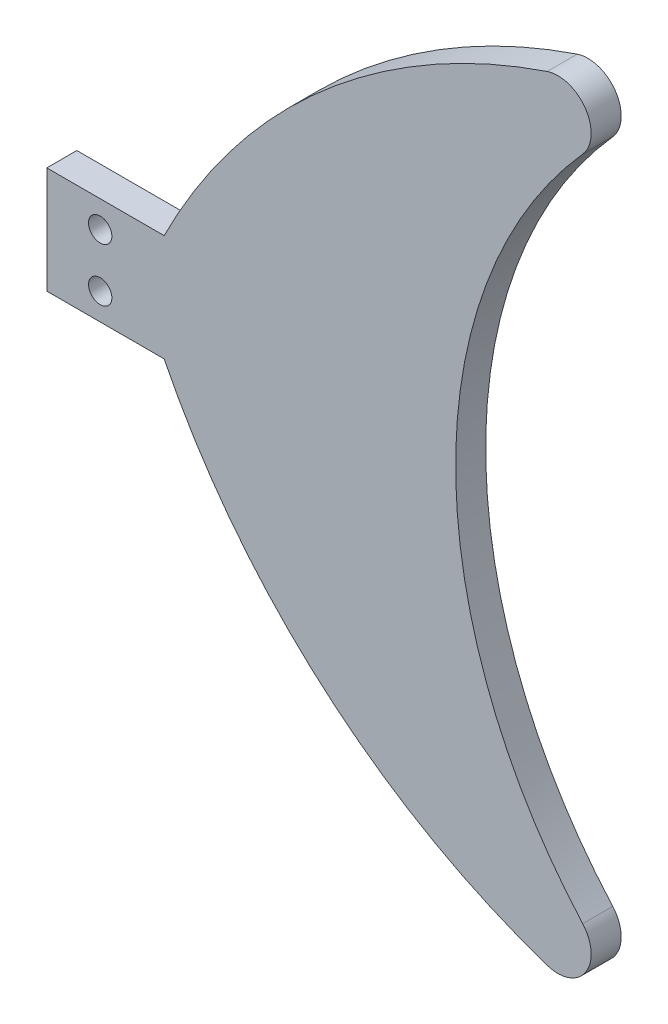
ISO-10303-21;
HEADER;
FILE_DESCRIPTION(('STEP AP214'),'2;1');
FILE_NAME('part.step','',(''),(''),'','','');
FILE_SCHEMA(('AUTOMOTIVE_DESIGN { 1 0 10303 214 1 1 1 1 }'));
ENDSEC;
DATA;
#1=APPLICATION_CONTEXT('core data for automotive mechanical design processes');
#2=APPLICATION_PROTOCOL_DEFINITION('international standard','automotive_design',2000,#1);
#3=PRODUCT_CONTEXT('',#1,'mechanical');
#4=PRODUCT('Part','Part','',(#3));
#5=PRODUCT_RELATED_PRODUCT_CATEGORY('part','',(#4));
#6=PRODUCT_DEFINITION_FORMATION('','',#4);
#7=PRODUCT_DEFINITION_CONTEXT('part definition',#1,'design');
#8=PRODUCT_DEFINITION('design','',#6,#7);
#9=PRODUCT_DEFINITION_SHAPE('','',#8);
#10=(LENGTH_UNIT() NAMED_UNIT(*) SI_UNIT(.MILLI.,.METRE.));
#11=(NAMED_UNIT(*) PLANE_ANGLE_UNIT() SI_UNIT($,.RADIAN.));
#12=(NAMED_UNIT(*) SI_UNIT($,.STERADIAN.) SOLID_ANGLE_UNIT());
#13=UNCERTAINTY_MEASURE_WITH_UNIT(LENGTH_MEASURE(1.E-05),#10,'distance_accuracy_value','');
#14=(GEOMETRIC_REPRESENTATION_CONTEXT(3) GLOBAL_UNCERTAINTY_ASSIGNED_CONTEXT((#13)) GLOBAL_UNIT_ASSIGNED_CONTEXT((#10,
#11,#12)) REPRESENTATION_CONTEXT('',''));
#15=CARTESIAN_POINT('',(0.,0.,0.));
#16=DIRECTION('',(0.,0.,1.));
#17=DIRECTION('',(1.,0.,0.));
#18=AXIS2_PLACEMENT_3D('',#15,#16,#17);
#19=CARTESIAN_POINT('',(-1.93712943361398,0.,0.));
#20=DIRECTION('',(0.,0.,1.));
#21=DIRECTION('',(1.,0.,0.));
#22=AXIS2_PLACEMENT_3D('',#19,#20,#21);
#23=PLANE('',#22);
#24=CARTESIAN_POINT('',(-15.,-4.,0.));
#25=DIRECTION('',(0.,0.,1.));
#26=DIRECTION('',(-1.,0.,0.));
#27=AXIS2_PLACEMENT_3D('',#24,#25,#26);
#28=CIRCLE('',#27,1.75);
#29=CARTESIAN_POINT('',(-16.75,-4.,0.));
#30=VERTEX_POINT('',#29);
#31=EDGE_CURVE('E226',#30,#30,#28,.T.);
#32=ORIENTED_EDGE('',*,*,#31,.T.);
#33=EDGE_LOOP('',(#32));
#34=FACE_BOUND('',#33,.T.);
#35=CARTESIAN_POINT('',(-15.,4.,0.));
#36=DIRECTION('',(0.,0.,1.));
#37=DIRECTION('',(1.,0.,0.));
#38=AXIS2_PLACEMENT_3D('',#35,#36,#37);
#39=CIRCLE('',#38,1.75);
#40=CARTESIAN_POINT('',(-13.25,4.,0.));
#41=VERTEX_POINT('',#40);
#42=EDGE_CURVE('E125',#41,#41,#39,.T.);
#43=ORIENTED_EDGE('',*,*,#42,.T.);
#44=EDGE_LOOP('',(#43));
#45=FACE_BOUND('',#44,.T.);
#46=CARTESIAN_POINT('',(84.0294989382702,36.7226286448998,0.));
#47=DIRECTION('',(0.,0.,1.));
#48=DIRECTION('',(1.,0.,0.));
#49=AXIS2_PLACEMENT_3D('',#46,#47,#48);
#50=CIRCLE('',#49,100.);
#51=CARTESIAN_POINT('',(-5.41258560301487,-8.,0.));
#52=VERTEX_POINT('',#51);
#53=CARTESIAN_POINT('',(51.977234616643,-58.0014567392122,0.));
#54=VERTEX_POINT('',#53);
#55=EDGE_CURVE('E144',#52,#54,#50,.T.);
#56=ORIENTED_EDGE('',*,*,#55,.F.);
#57=DIRECTION('',(1.,0.,0.));
#58=VECTOR('',#57,1.);
#59=CARTESIAN_POINT('',(-1.93712943361398,-8.,0.));
#60=LINE('',#59,#58);
#61=CARTESIAN_POINT('',(-23.,-8.,0.));
#62=VERTEX_POINT('',#61);
#63=EDGE_CURVE('E115',#62,#52,#60,.T.);
#64=ORIENTED_EDGE('',*,*,#63,.F.);
#65=DIRECTION('',(0.,-1.,0.));
#66=VECTOR('',#65,1.);
#67=CARTESIAN_POINT('',(-23.,8.,0.));
#68=LINE('',#67,#66);
#69=CARTESIAN_POINT('',(-23.,8.,0.));
#70=VERTEX_POINT('',#69);
#71=EDGE_CURVE('E113',#70,#62,#68,.T.);
#72=ORIENTED_EDGE('',*,*,#71,.F.);
#73=DIRECTION('',(1.,0.,0.));
#74=VECTOR('',#73,1.);
#75=CARTESIAN_POINT('',(-1.93712943361398,8.,0.));
#76=LINE('',#75,#74);
#77=CARTESIAN_POINT('',(-5.41258560301487,8.,0.));
#78=VERTEX_POINT('',#77);
#79=EDGE_CURVE('E101',#70,#78,#76,.T.);
#80=ORIENTED_EDGE('',*,*,#79,.T.);
#81=CARTESIAN_POINT('',(84.0294989382702,-36.7226286448998,0.));
#82=DIRECTION('',(0.,0.,1.));
#83=DIRECTION('',(1.,0.,0.));
#84=AXIS2_PLACEMENT_3D('',#81,#82,#83);
#85=CIRCLE('',#84,100.);
#86=CARTESIAN_POINT('',(51.977234616643,58.0014567392122,0.));
#87=VERTEX_POINT('',#86);
#88=EDGE_CURVE('E152',#78,#87,#85,.F.);
#89=ORIENTED_EDGE('',*,*,#88,.T.);
#90=CARTESIAN_POINT('',(53.5798478327243,53.2652524700066,0.));
#91=DIRECTION('',(0.,0.,1.));
#92=DIRECTION('',(1.,0.,0.));
#93=AXIS2_PLACEMENT_3D('',#90,#91,#92);
#94=CIRCLE('',#93,5.);
#95=CARTESIAN_POINT('',(57.3104292632511,49.9361741906312,0.));
#96=VERTEX_POINT('',#95);
#97=EDGE_CURVE('E56',#87,#96,#94,.F.);
#98=ORIENTED_EDGE('',*,*,#97,.T.);
#99=CARTESIAN_POINT('',(113.269150721152,0.,0.));
#100=DIRECTION('',(0.,0.,-1.));
#101=DIRECTION('',(-1.,0.,0.));
#102=AXIS2_PLACEMENT_3D('',#99,#100,#101);
#103=CIRCLE('',#102,75.);
#104=CARTESIAN_POINT('',(57.3104292632511,-49.9361741906312,0.));
#105=VERTEX_POINT('',#104);
#106=EDGE_CURVE('E154',#105,#96,#103,.T.);
#107=ORIENTED_EDGE('',*,*,#106,.F.);
#108=CARTESIAN_POINT('',(53.5798478327243,-53.2652524700066,0.));
#109=DIRECTION('',(0.,0.,1.));
#110=DIRECTION('',(1.,0.,0.));
#111=AXIS2_PLACEMENT_3D('',#108,#109,#110);
#112=CIRCLE('',#111,5.);
#113=EDGE_CURVE('E44',#105,#54,#112,.F.);
#114=ORIENTED_EDGE('',*,*,#113,.T.);
#115=EDGE_LOOP('',(#56,#64,#72,#80,#89,#98,#107,#114));
#116=FACE_BOUND('',#115,.T.);
#117=ADVANCED_FACE('F36',(#34,#45,#116),#23,.F.);
#118=CARTESIAN_POINT('',(-1.93712943361398,0.,4.5));
#119=DIRECTION('',(0.,0.,1.));
#120=DIRECTION('',(1.,0.,0.));
#121=AXIS2_PLACEMENT_3D('',#118,#119,#120);
#122=PLANE('',#121);
#123=CARTESIAN_POINT('',(-15.,-4.,4.5));
#124=DIRECTION('',(0.,0.,1.));
#125=DIRECTION('',(-1.,0.,0.));
#126=AXIS2_PLACEMENT_3D('',#123,#124,#125);
#127=CIRCLE('',#126,1.75);
#128=CARTESIAN_POINT('',(-16.75,-4.,4.5));
#129=VERTEX_POINT('',#128);
#130=EDGE_CURVE('E229',#129,#129,#127,.T.);
#131=ORIENTED_EDGE('',*,*,#130,.F.);
#132=EDGE_LOOP('',(#131));
#133=FACE_BOUND('',#132,.T.);
#134=CARTESIAN_POINT('',(-15.,4.,4.5));
#135=DIRECTION('',(0.,0.,1.));
#136=DIRECTION('',(1.,0.,0.));
#137=AXIS2_PLACEMENT_3D('',#134,#135,#136);
#138=CIRCLE('',#137,1.75);
#139=CARTESIAN_POINT('',(-13.25,4.,4.5));
#140=VERTEX_POINT('',#139);
#141=EDGE_CURVE('E128',#140,#140,#138,.T.);
#142=ORIENTED_EDGE('',*,*,#141,.F.);
#143=EDGE_LOOP('',(#142));
#144=FACE_BOUND('',#143,.T.);
#145=DIRECTION('',(1.,0.,0.));
#146=VECTOR('',#145,1.);
#147=CARTESIAN_POINT('',(0.,-8.,4.5));
#148=LINE('',#147,#146);
#149=CARTESIAN_POINT('',(-23.,-8.,4.5));
#150=VERTEX_POINT('',#149);
#151=CARTESIAN_POINT('',(-5.41258560301487,-8.,4.5));
#152=VERTEX_POINT('',#151);
#153=EDGE_CURVE('E134',#150,#152,#148,.T.);
#154=ORIENTED_EDGE('',*,*,#153,.T.);
#155=CARTESIAN_POINT('',(84.0294989382702,36.7226286448998,4.5));
#156=DIRECTION('',(0.,0.,-1.));
#157=DIRECTION('',(1.,0.,0.));
#158=AXIS2_PLACEMENT_3D('',#155,#156,#157);
#159=CIRCLE('',#158,100.);
#160=CARTESIAN_POINT('',(51.977234616643,-58.0014567392122,4.5));
#161=VERTEX_POINT('',#160);
#162=EDGE_CURVE('E110',#161,#152,#159,.T.);
#163=ORIENTED_EDGE('',*,*,#162,.F.);
#164=CARTESIAN_POINT('',(53.5798478327243,-53.2652524700066,4.5));
#165=DIRECTION('',(0.,0.,1.));
#166=DIRECTION('',(1.,0.,0.));
#167=AXIS2_PLACEMENT_3D('',#164,#165,#166);
#168=CIRCLE('',#167,5.);
#169=CARTESIAN_POINT('',(57.3104292632511,-49.9361741906312,4.5));
#170=VERTEX_POINT('',#169);
#171=EDGE_CURVE('E164',#161,#170,#168,.T.);
#172=ORIENTED_EDGE('',*,*,#171,.T.);
#173=CARTESIAN_POINT('',(113.269150721152,0.,4.5));
#174=DIRECTION('',(0.,0.,1.));
#175=DIRECTION('',(1.,0.,0.));
#176=AXIS2_PLACEMENT_3D('',#173,#174,#175);
#177=CIRCLE('',#176,75.);
#178=CARTESIAN_POINT('',(57.3104292632511,49.9361741906312,4.5));
#179=VERTEX_POINT('',#178);
#180=EDGE_CURVE('E11',#179,#170,#177,.T.);
#181=ORIENTED_EDGE('',*,*,#180,.F.);
#182=CARTESIAN_POINT('',(53.5798478327243,53.2652524700066,4.5));
#183=DIRECTION('',(0.,0.,1.));
#184=DIRECTION('',(1.,0.,0.));
#185=AXIS2_PLACEMENT_3D('',#182,#183,#184);
#186=CIRCLE('',#185,5.);
#187=CARTESIAN_POINT('',(51.977234616643,58.0014567392122,4.5));
#188=VERTEX_POINT('',#187);
#189=EDGE_CURVE('E160',#179,#188,#186,.T.);
#190=ORIENTED_EDGE('',*,*,#189,.T.);
#191=CARTESIAN_POINT('',(84.0294989382702,-36.7226286448998,4.5));
#192=DIRECTION('',(0.,0.,1.));
#193=DIRECTION('',(1.,0.,0.));
#194=AXIS2_PLACEMENT_3D('',#191,#192,#193);
#195=CIRCLE('',#194,100.);
#196=CARTESIAN_POINT('',(-5.41258560301487,8.,4.5));
#197=VERTEX_POINT('',#196);
#198=EDGE_CURVE('E146',#188,#197,#195,.T.);
#199=ORIENTED_EDGE('',*,*,#198,.T.);
#200=DIRECTION('',(1.,0.,0.));
#201=VECTOR('',#200,1.);
#202=CARTESIAN_POINT('',(0.,8.,4.5));
#203=LINE('',#202,#201);
#204=CARTESIAN_POINT('',(-23.,8.,4.5));
#205=VERTEX_POINT('',#204);
#206=EDGE_CURVE('E141',#205,#197,#203,.T.);
#207=ORIENTED_EDGE('',*,*,#206,.F.);
#208=DIRECTION('',(0.,1.,0.));
#209=VECTOR('',#208,1.);
#210=CARTESIAN_POINT('',(-23.,-8.,4.5));
#211=LINE('',#210,#209);
#212=EDGE_CURVE('E124',#150,#205,#211,.T.);
#213=ORIENTED_EDGE('',*,*,#212,.F.);
#214=EDGE_LOOP('',(#154,#163,#172,#181,#190,#199,#207,#213));
#215=FACE_BOUND('',#214,.T.);
#216=ADVANCED_FACE('F178',(#133,#144,#215),#122,.T.);
#217=CARTESIAN_POINT('',(53.5798478327243,53.2652524700066,-124.697254365427));
#218=DIRECTION('',(0.,0.,1.));
#219=DIRECTION('',(1.,0.,0.));
#220=AXIS2_PLACEMENT_3D('',#217,#218,#219);
#221=CYLINDRICAL_SURFACE('',#220,5.);
#222=ORIENTED_EDGE('',*,*,#97,.F.);
#223=DIRECTION('',(0.,0.,1.));
#224=VECTOR('',#223,1.);
#225=CARTESIAN_POINT('',(51.977234616643,58.0014567392122,-70.8399329209354));
#226=LINE('',#225,#224);
#227=EDGE_CURVE('E51',#87,#188,#226,.T.);
#228=ORIENTED_EDGE('',*,*,#227,.T.);
#229=ORIENTED_EDGE('',*,*,#189,.F.);
#230=DIRECTION('',(0.,0.,-1.));
#231=VECTOR('',#230,1.);
#232=CARTESIAN_POINT('',(57.3104292632511,49.9361741906312,10.));
#233=LINE('',#232,#231);
#234=EDGE_CURVE('E158',#179,#96,#233,.T.);
#235=ORIENTED_EDGE('',*,*,#234,.T.);
#236=EDGE_LOOP('',(#222,#228,#229,#235));
#237=FACE_BOUND('',#236,.T.);
#238=ADVANCED_FACE('F38',(#237),#221,.T.);
#239=CARTESIAN_POINT('',(53.5798478327243,-53.2652524700066,-124.697254365427));
#240=DIRECTION('',(0.,0.,1.));
#241=DIRECTION('',(1.,0.,0.));
#242=AXIS2_PLACEMENT_3D('',#239,#240,#241);
#243=CYLINDRICAL_SURFACE('',#242,5.);
#244=DIRECTION('',(0.,0.,1.));
#245=VECTOR('',#244,1.);
#246=CARTESIAN_POINT('',(51.977234616643,-58.0014567392122,-70.8399329209354));
#247=LINE('',#246,#245);
#248=EDGE_CURVE('E147',#54,#161,#247,.T.);
#249=ORIENTED_EDGE('',*,*,#248,.F.);
#250=ORIENTED_EDGE('',*,*,#113,.F.);
#251=DIRECTION('',(0.,0.,-1.));
#252=VECTOR('',#251,1.);
#253=CARTESIAN_POINT('',(57.3104292632511,-49.9361741906312,10.));
#254=LINE('',#253,#252);
#255=EDGE_CURVE('E157',#170,#105,#254,.T.);
#256=ORIENTED_EDGE('',*,*,#255,.F.);
#257=ORIENTED_EDGE('',*,*,#171,.F.);
#258=EDGE_LOOP('',(#249,#250,#256,#257));
#259=FACE_BOUND('',#258,.T.);
#260=ADVANCED_FACE('F171',(#259),#243,.T.);
#261=CARTESIAN_POINT('',(113.269150721152,0.,10.));
#262=DIRECTION('',(0.,0.,-1.));
#263=DIRECTION('',(-1.,0.,0.));
#264=AXIS2_PLACEMENT_3D('',#261,#262,#263);
#265=CYLINDRICAL_SURFACE('',#264,75.);
#266=ORIENTED_EDGE('',*,*,#180,.T.);
#267=ORIENTED_EDGE('',*,*,#255,.T.);
#268=ORIENTED_EDGE('',*,*,#106,.T.);
#269=ORIENTED_EDGE('',*,*,#234,.F.);
#270=EDGE_LOOP('',(#266,#267,#268,#269));
#271=FACE_BOUND('',#270,.T.);
#272=ADVANCED_FACE('F174',(#271),#265,.F.);
#273=CARTESIAN_POINT('',(84.0294989382702,-36.7226286448998,-70.8399329209354));
#274=DIRECTION('',(0.,0.,1.));
#275=DIRECTION('',(1.,0.,0.));
#276=AXIS2_PLACEMENT_3D('',#273,#274,#275);
#277=CYLINDRICAL_SURFACE('',#276,100.);
#278=ORIENTED_EDGE('',*,*,#88,.F.);
#279=DIRECTION('',(0.,0.,1.));
#280=VECTOR('',#279,1.);
#281=CARTESIAN_POINT('',(-5.41258560301487,8.,-5.5));
#282=LINE('',#281,#280);
#283=EDGE_CURVE('E108',#78,#197,#282,.T.);
#284=ORIENTED_EDGE('',*,*,#283,.T.);
#285=ORIENTED_EDGE('',*,*,#198,.F.);
#286=ORIENTED_EDGE('',*,*,#227,.F.);
#287=EDGE_LOOP('',(#278,#284,#285,#286));
#288=FACE_BOUND('',#287,.T.);
#289=ADVANCED_FACE('F187',(#288),#277,.T.);
#290=CARTESIAN_POINT('',(84.0294989382702,36.7226286448998,-70.8399329209354));
#291=DIRECTION('',(0.,0.,1.));
#292=DIRECTION('',(1.,0.,0.));
#293=AXIS2_PLACEMENT_3D('',#290,#291,#292);
#294=CYLINDRICAL_SURFACE('',#293,100.);
#295=ORIENTED_EDGE('',*,*,#162,.T.);
#296=DIRECTION('',(0.,0.,1.));
#297=VECTOR('',#296,1.);
#298=CARTESIAN_POINT('',(-5.41258560301487,-8.,-5.5));
#299=LINE('',#298,#297);
#300=EDGE_CURVE('E137',#52,#152,#299,.T.);
#301=ORIENTED_EDGE('',*,*,#300,.F.);
#302=ORIENTED_EDGE('',*,*,#55,.T.);
#303=ORIENTED_EDGE('',*,*,#248,.T.);
#304=EDGE_LOOP('',(#295,#301,#302,#303));
#305=FACE_BOUND('',#304,.T.);
#306=ADVANCED_FACE('F183',(#305),#294,.T.);
#307=CARTESIAN_POINT('',(0.,8.,-5.5));
#308=DIRECTION('',(0.,-1.,0.));
#309=DIRECTION('',(0.,0.,-1.));
#310=AXIS2_PLACEMENT_3D('',#307,#308,#309);
#311=PLANE('',#310);
#312=ORIENTED_EDGE('',*,*,#79,.F.);
#313=DIRECTION('',(0.,0.,-1.));
#314=VECTOR('',#313,1.);
#315=CARTESIAN_POINT('',(-23.,8.,4.5));
#316=LINE('',#315,#314);
#317=EDGE_CURVE('E106',#205,#70,#316,.T.);
#318=ORIENTED_EDGE('',*,*,#317,.F.);
#319=ORIENTED_EDGE('',*,*,#206,.T.);
#320=ORIENTED_EDGE('',*,*,#283,.F.);
#321=EDGE_LOOP('',(#312,#318,#319,#320));
#322=FACE_BOUND('',#321,.T.);
#323=ADVANCED_FACE('F103',(#322),#311,.F.);
#324=CARTESIAN_POINT('',(0.,-8.,-5.5));
#325=DIRECTION('',(0.,-1.,0.));
#326=DIRECTION('',(0.,0.,-1.));
#327=AXIS2_PLACEMENT_3D('',#324,#325,#326);
#328=PLANE('',#327);
#329=ORIENTED_EDGE('',*,*,#63,.T.);
#330=ORIENTED_EDGE('',*,*,#300,.T.);
#331=ORIENTED_EDGE('',*,*,#153,.F.);
#332=DIRECTION('',(0.,0.,1.));
#333=VECTOR('',#332,1.);
#334=CARTESIAN_POINT('',(-23.,-8.,0.));
#335=LINE('',#334,#333);
#336=EDGE_CURVE('E119',#62,#150,#335,.T.);
#337=ORIENTED_EDGE('',*,*,#336,.F.);
#338=EDGE_LOOP('',(#329,#330,#331,#337));
#339=FACE_BOUND('',#338,.T.);
#340=ADVANCED_FACE('F185',(#339),#328,.T.);
#341=CARTESIAN_POINT('',(-23.,0.,0.));
#342=DIRECTION('',(-1.,0.,0.));
#343=DIRECTION('',(0.,0.,1.));
#344=AXIS2_PLACEMENT_3D('',#341,#342,#343);
#345=PLANE('',#344);
#346=ORIENTED_EDGE('',*,*,#317,.T.);
#347=ORIENTED_EDGE('',*,*,#71,.T.);
#348=ORIENTED_EDGE('',*,*,#336,.T.);
#349=ORIENTED_EDGE('',*,*,#212,.T.);
#350=EDGE_LOOP('',(#346,#347,#348,#349));
#351=FACE_BOUND('',#350,.T.);
#352=ADVANCED_FACE('F122',(#351),#345,.T.);
#353=CARTESIAN_POINT('',(-15.,4.,0.));
#354=DIRECTION('',(0.,0.,1.));
#355=DIRECTION('',(1.,0.,0.));
#356=AXIS2_PLACEMENT_3D('',#353,#354,#355);
#357=CYLINDRICAL_SURFACE('',#356,1.75);
#358=ORIENTED_EDGE('',*,*,#42,.F.);
#359=EDGE_LOOP('',(#358));
#360=FACE_BOUND('',#359,.T.);
#361=ORIENTED_EDGE('',*,*,#141,.T.);
#362=EDGE_LOOP('',(#361));
#363=FACE_BOUND('',#362,.T.);
#364=ADVANCED_FACE('F215',(#360,#363),#357,.F.);
#365=CARTESIAN_POINT('',(-15.,-4.,0.));
#366=DIRECTION('',(0.,0.,1.));
#367=DIRECTION('',(1.,0.,0.));
#368=AXIS2_PLACEMENT_3D('',#365,#366,#367);
#369=CYLINDRICAL_SURFACE('',#368,1.75);
#370=ORIENTED_EDGE('',*,*,#31,.F.);
#371=EDGE_LOOP('',(#370));
#372=FACE_BOUND('',#371,.T.);
#373=ORIENTED_EDGE('',*,*,#130,.T.);
#374=EDGE_LOOP('',(#373));
#375=FACE_BOUND('',#374,.T.);
#376=ADVANCED_FACE('F218',(#372,#375),#369,.F.);
#377=CLOSED_SHELL('',(#117,#216,#238,#260,#272,#289,#306,#323,#340,#352,#364,#376));
#378=MANIFOLD_SOLID_BREP('B2',#377);
#379=ADVANCED_BREP_SHAPE_REPRESENTATION('',(#18,#378),#14);
#380=SHAPE_DEFINITION_REPRESENTATION(#9,#379);
ENDSEC;
END-ISO-10303-21;
